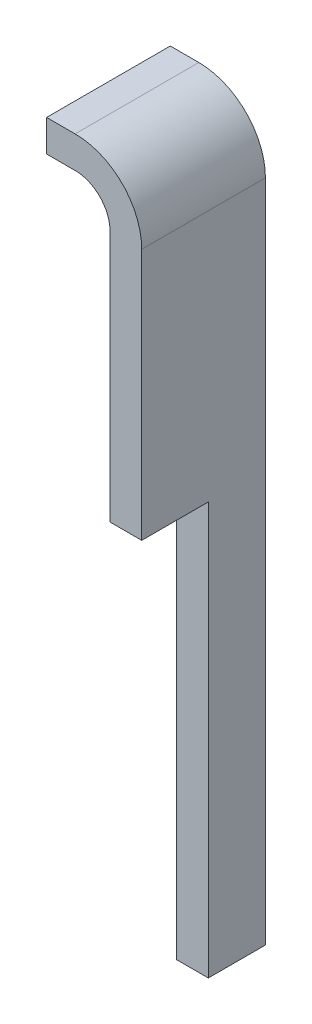
ISO-10303-21;
HEADER;
FILE_DESCRIPTION(('STEP AP214'),'2;1');
FILE_NAME('part.step','',(''),(''),'','','');
FILE_SCHEMA(('AUTOMOTIVE_DESIGN { 1 0 10303 214 1 1 1 1 }'));
ENDSEC;
DATA;
#1=APPLICATION_CONTEXT('core data for automotive mechanical design processes');
#2=APPLICATION_PROTOCOL_DEFINITION('international standard','automotive_design',2000,#1);
#3=PRODUCT_CONTEXT('',#1,'mechanical');
#4=PRODUCT('Part','Part','',(#3));
#5=PRODUCT_RELATED_PRODUCT_CATEGORY('part','',(#4));
#6=PRODUCT_DEFINITION_FORMATION('','',#4);
#7=PRODUCT_DEFINITION_CONTEXT('part definition',#1,'design');
#8=PRODUCT_DEFINITION('design','',#6,#7);
#9=PRODUCT_DEFINITION_SHAPE('','',#8);
#10=(LENGTH_UNIT() NAMED_UNIT(*) SI_UNIT(.MILLI.,.METRE.));
#11=(NAMED_UNIT(*) PLANE_ANGLE_UNIT() SI_UNIT($,.RADIAN.));
#12=(NAMED_UNIT(*) SI_UNIT($,.STERADIAN.) SOLID_ANGLE_UNIT());
#13=UNCERTAINTY_MEASURE_WITH_UNIT(LENGTH_MEASURE(1.E-05),#10,'distance_accuracy_value','');
#14=(GEOMETRIC_REPRESENTATION_CONTEXT(3) GLOBAL_UNCERTAINTY_ASSIGNED_CONTEXT((#13)) GLOBAL_UNIT_ASSIGNED_CONTEXT((#10,
#11,#12)) REPRESENTATION_CONTEXT('',''));
#15=CARTESIAN_POINT('',(0.,0.,0.));
#16=DIRECTION('',(0.,0.,1.));
#17=DIRECTION('',(1.,0.,0.));
#18=AXIS2_PLACEMENT_3D('',#15,#16,#17);
#19=CARTESIAN_POINT('',(0.508,-5.7277,-0.762));
#20=DIRECTION('',(0.,-1.,0.));
#21=DIRECTION('',(0.,0.,-1.));
#22=AXIS2_PLACEMENT_3D('',#19,#20,#21);
#23=PLANE('',#22);
#24=DIRECTION('',(0.,0.,1.));
#25=VECTOR('',#24,1.);
#26=CARTESIAN_POINT('',(0.762,-5.7277,-0.2286));
#27=LINE('',#26,#25);
#28=CARTESIAN_POINT('',(0.762,-5.7277,-0.2286));
#29=VERTEX_POINT('',#28);
#30=CARTESIAN_POINT('',(0.762,-5.7277,0.2286));
#31=VERTEX_POINT('',#30);
#32=EDGE_CURVE('E148',#29,#31,#27,.T.);
#33=ORIENTED_EDGE('',*,*,#32,.T.);
#34=DIRECTION('',(1.,0.,0.));
#35=VECTOR('',#34,1.);
#36=CARTESIAN_POINT('',(0.508,-5.7277,0.2286));
#37=LINE('',#36,#35);
#38=CARTESIAN_POINT('',(0.508,-5.7277,0.2286));
#39=VERTEX_POINT('',#38);
#40=EDGE_CURVE('E11',#39,#31,#37,.T.);
#41=ORIENTED_EDGE('',*,*,#40,.F.);
#42=DIRECTION('',(0.,0.,1.));
#43=VECTOR('',#42,1.);
#44=CARTESIAN_POINT('',(0.508,-5.7277,-0.2286));
#45=LINE('',#44,#43);
#46=CARTESIAN_POINT('',(0.508,-5.7277,-0.2286));
#47=VERTEX_POINT('',#46);
#48=EDGE_CURVE('E96',#47,#39,#45,.T.);
#49=ORIENTED_EDGE('',*,*,#48,.F.);
#50=DIRECTION('',(1.,0.,0.));
#51=VECTOR('',#50,1.);
#52=CARTESIAN_POINT('',(0.508,-5.7277,-0.2286));
#53=LINE('',#52,#51);
#54=EDGE_CURVE('E150',#47,#29,#53,.T.);
#55=ORIENTED_EDGE('',*,*,#54,.T.);
#56=EDGE_LOOP('',(#33,#41,#49,#55));
#57=FACE_BOUND('',#56,.T.);
#58=ADVANCED_FACE('F16',(#57),#23,.T.);
#59=CARTESIAN_POINT('',(0.762,-5.7277,0.2286));
#60=DIRECTION('',(0.,0.,-1.));
#61=DIRECTION('',(0.,-1.,0.));
#62=AXIS2_PLACEMENT_3D('',#59,#60,#61);
#63=PLANE('',#62);
#64=DIRECTION('',(-1.,0.,0.));
#65=VECTOR('',#64,1.);
#66=CARTESIAN_POINT('',(0.762,-2.4257,0.2286));
#67=LINE('',#66,#65);
#68=CARTESIAN_POINT('',(0.762,-2.4257,0.2286));
#69=VERTEX_POINT('',#68);
#70=CARTESIAN_POINT('',(0.508,-2.4257,0.2286));
#71=VERTEX_POINT('',#70);
#72=EDGE_CURVE('E165',#69,#71,#67,.T.);
#73=ORIENTED_EDGE('',*,*,#72,.T.);
#74=DIRECTION('',(0.,1.,0.));
#75=VECTOR('',#74,1.);
#76=CARTESIAN_POINT('',(0.508,-5.7277,0.2286));
#77=LINE('',#76,#75);
#78=EDGE_CURVE('E27',#39,#71,#77,.T.);
#79=ORIENTED_EDGE('',*,*,#78,.F.);
#80=ORIENTED_EDGE('',*,*,#40,.T.);
#81=DIRECTION('',(0.,1.,0.));
#82=VECTOR('',#81,1.);
#83=CARTESIAN_POINT('',(0.762,-5.7277,0.2286));
#84=LINE('',#83,#82);
#85=EDGE_CURVE('E156',#31,#69,#84,.T.);
#86=ORIENTED_EDGE('',*,*,#85,.T.);
#87=EDGE_LOOP('',(#73,#79,#80,#86));
#88=FACE_BOUND('',#87,.T.);
#89=ADVANCED_FACE('F253',(#88),#63,.F.);
#90=CARTESIAN_POINT('',(0.508,-0.4064,-0.762));
#91=DIRECTION('',(-1.,0.,0.));
#92=DIRECTION('',(0.,0.,1.));
#93=AXIS2_PLACEMENT_3D('',#90,#91,#92);
#94=PLANE('',#93);
#95=ORIENTED_EDGE('',*,*,#48,.T.);
#96=ORIENTED_EDGE('',*,*,#78,.T.);
#97=DIRECTION('',(0.,0.,-1.));
#98=VECTOR('',#97,1.);
#99=CARTESIAN_POINT('',(0.508,-2.4257,0.762));
#100=LINE('',#99,#98);
#101=CARTESIAN_POINT('',(0.508,-2.4257,0.762));
#102=VERTEX_POINT('',#101);
#103=EDGE_CURVE('E172',#102,#71,#100,.T.);
#104=ORIENTED_EDGE('',*,*,#103,.F.);
#105=DIRECTION('',(0.,-1.,0.));
#106=VECTOR('',#105,1.);
#107=CARTESIAN_POINT('',(0.508,-0.4064,0.762));
#108=LINE('',#107,#106);
#109=CARTESIAN_POINT('',(0.508,-0.4064,0.762));
#110=VERTEX_POINT('',#109);
#111=EDGE_CURVE('E201',#110,#102,#108,.T.);
#112=ORIENTED_EDGE('',*,*,#111,.F.);
#113=DIRECTION('',(0.,0.,1.));
#114=VECTOR('',#113,1.);
#115=CARTESIAN_POINT('',(0.508,-0.4064,-0.2286));
#116=LINE('',#115,#114);
#117=CARTESIAN_POINT('',(0.508,-0.4064,-0.2286));
#118=VERTEX_POINT('',#117);
#119=EDGE_CURVE('E104',#118,#110,#116,.T.);
#120=ORIENTED_EDGE('',*,*,#119,.F.);
#121=DIRECTION('',(0.,-1.,0.));
#122=VECTOR('',#121,1.);
#123=CARTESIAN_POINT('',(0.508,-0.4064,-0.2286));
#124=LINE('',#123,#122);
#125=EDGE_CURVE('E208',#118,#47,#124,.T.);
#126=ORIENTED_EDGE('',*,*,#125,.T.);
#127=EDGE_LOOP('',(#95,#96,#104,#112,#120,#126));
#128=FACE_BOUND('',#127,.T.);
#129=ADVANCED_FACE('F251',(#128),#94,.T.);
#130=CARTESIAN_POINT('',(0.2286,-0.4064,-0.762));
#131=DIRECTION('',(0.,0.,1.));
#132=DIRECTION('',(1.,0.,0.));
#133=AXIS2_PLACEMENT_3D('',#130,#131,#132);
#134=CYLINDRICAL_SURFACE('',#133,0.2794);
#135=ORIENTED_EDGE('',*,*,#119,.T.);
#136=CARTESIAN_POINT('',(0.2286,-0.4064,0.762));
#137=DIRECTION('',(0.,0.,-1.));
#138=DIRECTION('',(0.,1.,0.));
#139=AXIS2_PLACEMENT_3D('',#136,#137,#138);
#140=CIRCLE('',#139,0.2794);
#141=CARTESIAN_POINT('',(0.2286,-0.127,0.762));
#142=VERTEX_POINT('',#141);
#143=EDGE_CURVE('E197',#142,#110,#140,.T.);
#144=ORIENTED_EDGE('',*,*,#143,.F.);
#145=DIRECTION('',(0.,0.,1.));
#146=VECTOR('',#145,1.);
#147=CARTESIAN_POINT('',(0.2286,-0.127,-0.2286));
#148=LINE('',#147,#146);
#149=CARTESIAN_POINT('',(0.2286,-0.127,-0.2286));
#150=VERTEX_POINT('',#149);
#151=EDGE_CURVE('E114',#150,#142,#148,.T.);
#152=ORIENTED_EDGE('',*,*,#151,.F.);
#153=CARTESIAN_POINT('',(0.2286,-0.4064,-0.2286));
#154=DIRECTION('',(0.,0.,1.));
#155=DIRECTION('',(1.,0.,0.));
#156=AXIS2_PLACEMENT_3D('',#153,#154,#155);
#157=CIRCLE('',#156,0.2794);
#158=EDGE_CURVE('E218',#118,#150,#157,.T.);
#159=ORIENTED_EDGE('',*,*,#158,.F.);
#160=EDGE_LOOP('',(#135,#144,#152,#159));
#161=FACE_BOUND('',#160,.T.);
#162=ADVANCED_FACE('F263',(#161),#134,.F.);
#163=CARTESIAN_POINT('',(0.,-0.127,-0.762));
#164=DIRECTION('',(0.,-1.,0.));
#165=DIRECTION('',(0.,0.,-1.));
#166=AXIS2_PLACEMENT_3D('',#163,#164,#165);
#167=PLANE('',#166);
#168=ORIENTED_EDGE('',*,*,#151,.T.);
#169=DIRECTION('',(1.,0.,0.));
#170=VECTOR('',#169,1.);
#171=CARTESIAN_POINT('',(0.,-0.127,0.762));
#172=LINE('',#171,#170);
#173=CARTESIAN_POINT('',(0.,-0.127,0.762));
#174=VERTEX_POINT('',#173);
#175=EDGE_CURVE('E176',#174,#142,#172,.T.);
#176=ORIENTED_EDGE('',*,*,#175,.F.);
#177=DIRECTION('',(0.,0.,1.));
#178=VECTOR('',#177,1.);
#179=CARTESIAN_POINT('',(0.,-0.127,-0.2286));
#180=LINE('',#179,#178);
#181=CARTESIAN_POINT('',(0.,-0.127,-0.2286));
#182=VERTEX_POINT('',#181);
#183=EDGE_CURVE('E184',#182,#174,#180,.T.);
#184=ORIENTED_EDGE('',*,*,#183,.F.);
#185=DIRECTION('',(1.,0.,0.));
#186=VECTOR('',#185,1.);
#187=CARTESIAN_POINT('',(0.,-0.127,-0.2286));
#188=LINE('',#187,#186);
#189=EDGE_CURVE('E216',#182,#150,#188,.T.);
#190=ORIENTED_EDGE('',*,*,#189,.T.);
#191=EDGE_LOOP('',(#168,#176,#184,#190));
#192=FACE_BOUND('',#191,.T.);
#193=ADVANCED_FACE('F269',(#192),#167,.T.);
#194=CARTESIAN_POINT('',(0.,0.127,-0.762));
#195=DIRECTION('',(-1.,0.,0.));
#196=DIRECTION('',(0.,0.,1.));
#197=AXIS2_PLACEMENT_3D('',#194,#195,#196);
#198=PLANE('',#197);
#199=ORIENTED_EDGE('',*,*,#183,.T.);
#200=DIRECTION('',(0.,-1.,0.));
#201=VECTOR('',#200,1.);
#202=CARTESIAN_POINT('',(0.,0.127,0.762));
#203=LINE('',#202,#201);
#204=CARTESIAN_POINT('',(0.,0.127,0.762));
#205=VERTEX_POINT('',#204);
#206=EDGE_CURVE('E185',#205,#174,#203,.T.);
#207=ORIENTED_EDGE('',*,*,#206,.F.);
#208=DIRECTION('',(0.,0.,1.));
#209=VECTOR('',#208,1.);
#210=CARTESIAN_POINT('',(0.,0.127,-0.2286));
#211=LINE('',#210,#209);
#212=CARTESIAN_POINT('',(0.,0.127,-0.2286));
#213=VERTEX_POINT('',#212);
#214=EDGE_CURVE('E181',#213,#205,#211,.T.);
#215=ORIENTED_EDGE('',*,*,#214,.F.);
#216=DIRECTION('',(0.,-1.,0.));
#217=VECTOR('',#216,1.);
#218=CARTESIAN_POINT('',(0.,0.127,-0.2286));
#219=LINE('',#218,#217);
#220=EDGE_CURVE('E211',#213,#182,#219,.T.);
#221=ORIENTED_EDGE('',*,*,#220,.T.);
#222=EDGE_LOOP('',(#199,#207,#215,#221));
#223=FACE_BOUND('',#222,.T.);
#224=ADVANCED_FACE('F272',(#223),#198,.T.);
#225=CARTESIAN_POINT('',(0.2286,0.127,-0.762));
#226=DIRECTION('',(0.,1.,0.));
#227=DIRECTION('',(1.,0.,0.));
#228=AXIS2_PLACEMENT_3D('',#225,#226,#227);
#229=PLANE('',#228);
#230=ORIENTED_EDGE('',*,*,#214,.T.);
#231=DIRECTION('',(-1.,0.,0.));
#232=VECTOR('',#231,1.);
#233=CARTESIAN_POINT('',(0.2286,0.127,0.762));
#234=LINE('',#233,#232);
#235=CARTESIAN_POINT('',(0.2286,0.127,0.762));
#236=VERTEX_POINT('',#235);
#237=EDGE_CURVE('E189',#236,#205,#234,.T.);
#238=ORIENTED_EDGE('',*,*,#237,.F.);
#239=DIRECTION('',(0.,0.,1.));
#240=VECTOR('',#239,1.);
#241=CARTESIAN_POINT('',(0.2286,0.127,-0.2286));
#242=LINE('',#241,#240);
#243=CARTESIAN_POINT('',(0.2286,0.127,-0.2286));
#244=VERTEX_POINT('',#243);
#245=EDGE_CURVE('E140',#244,#236,#242,.T.);
#246=ORIENTED_EDGE('',*,*,#245,.F.);
#247=DIRECTION('',(-1.,0.,0.));
#248=VECTOR('',#247,1.);
#249=CARTESIAN_POINT('',(0.2286,0.127,-0.2286));
#250=LINE('',#249,#248);
#251=EDGE_CURVE('E136',#244,#213,#250,.T.);
#252=ORIENTED_EDGE('',*,*,#251,.T.);
#253=EDGE_LOOP('',(#230,#238,#246,#252));
#254=FACE_BOUND('',#253,.T.);
#255=ADVANCED_FACE('F278',(#254),#229,.T.);
#256=CARTESIAN_POINT('',(0.2286,-0.4064,-0.762));
#257=DIRECTION('',(0.,0.,1.));
#258=DIRECTION('',(1.,0.,0.));
#259=AXIS2_PLACEMENT_3D('',#256,#257,#258);
#260=CYLINDRICAL_SURFACE('',#259,0.5334);
#261=ORIENTED_EDGE('',*,*,#245,.T.);
#262=CARTESIAN_POINT('',(0.2286,-0.4064,0.762));
#263=DIRECTION('',(0.,0.,1.));
#264=DIRECTION('',(1.,0.,0.));
#265=AXIS2_PLACEMENT_3D('',#262,#263,#264);
#266=CIRCLE('',#265,0.5334);
#267=CARTESIAN_POINT('',(0.762,-0.4064,0.762));
#268=VERTEX_POINT('',#267);
#269=EDGE_CURVE('E153',#268,#236,#266,.T.);
#270=ORIENTED_EDGE('',*,*,#269,.F.);
#271=DIRECTION('',(0.,0.,1.));
#272=VECTOR('',#271,1.);
#273=CARTESIAN_POINT('',(0.762,-0.4064,-0.2286));
#274=LINE('',#273,#272);
#275=CARTESIAN_POINT('',(0.762,-0.4064,-0.2286));
#276=VERTEX_POINT('',#275);
#277=EDGE_CURVE('E20',#276,#268,#274,.T.);
#278=ORIENTED_EDGE('',*,*,#277,.F.);
#279=CARTESIAN_POINT('',(0.2286,-0.4064,-0.2286));
#280=DIRECTION('',(0.,0.,1.));
#281=DIRECTION('',(1.,0.,0.));
#282=AXIS2_PLACEMENT_3D('',#279,#280,#281);
#283=CIRCLE('',#282,0.5334);
#284=EDGE_CURVE('E128',#276,#244,#283,.T.);
#285=ORIENTED_EDGE('',*,*,#284,.T.);
#286=EDGE_LOOP('',(#261,#270,#278,#285));
#287=FACE_BOUND('',#286,.T.);
#288=ADVANCED_FACE('F18',(#287),#260,.T.);
#289=CARTESIAN_POINT('',(0.762,-5.7277,-0.2286));
#290=DIRECTION('',(0.,0.,-1.));
#291=DIRECTION('',(0.,-1.,0.));
#292=AXIS2_PLACEMENT_3D('',#289,#290,#291);
#293=PLANE('',#292);
#294=ORIENTED_EDGE('',*,*,#54,.F.);
#295=ORIENTED_EDGE('',*,*,#125,.F.);
#296=ORIENTED_EDGE('',*,*,#158,.T.);
#297=ORIENTED_EDGE('',*,*,#189,.F.);
#298=ORIENTED_EDGE('',*,*,#220,.F.);
#299=ORIENTED_EDGE('',*,*,#251,.F.);
#300=ORIENTED_EDGE('',*,*,#284,.F.);
#301=DIRECTION('',(0.,1.,0.));
#302=VECTOR('',#301,1.);
#303=CARTESIAN_POINT('',(0.762,-5.7277,-0.2286));
#304=LINE('',#303,#302);
#305=EDGE_CURVE('E132',#29,#276,#304,.T.);
#306=ORIENTED_EDGE('',*,*,#305,.F.);
#307=EDGE_LOOP('',(#294,#295,#296,#297,#298,#299,#300,#306));
#308=FACE_BOUND('',#307,.T.);
#309=ADVANCED_FACE('F131',(#308),#293,.T.);
#310=CARTESIAN_POINT('',(0.762,-5.7277,-0.762));
#311=DIRECTION('',(1.,0.,0.));
#312=DIRECTION('',(0.,1.,0.));
#313=AXIS2_PLACEMENT_3D('',#310,#311,#312);
#314=PLANE('',#313);
#315=ORIENTED_EDGE('',*,*,#277,.T.);
#316=DIRECTION('',(0.,1.,0.));
#317=VECTOR('',#316,1.);
#318=CARTESIAN_POINT('',(0.762,-2.4257,0.762));
#319=LINE('',#318,#317);
#320=CARTESIAN_POINT('',(0.762,-2.4257,0.762));
#321=VERTEX_POINT('',#320);
#322=EDGE_CURVE('E237',#321,#268,#319,.T.);
#323=ORIENTED_EDGE('',*,*,#322,.F.);
#324=DIRECTION('',(0.,0.,-1.));
#325=VECTOR('',#324,1.);
#326=CARTESIAN_POINT('',(0.762,-2.4257,0.762));
#327=LINE('',#326,#325);
#328=EDGE_CURVE('E157',#321,#69,#327,.T.);
#329=ORIENTED_EDGE('',*,*,#328,.T.);
#330=ORIENTED_EDGE('',*,*,#85,.F.);
#331=ORIENTED_EDGE('',*,*,#32,.F.);
#332=ORIENTED_EDGE('',*,*,#305,.T.);
#333=EDGE_LOOP('',(#315,#323,#329,#330,#331,#332));
#334=FACE_BOUND('',#333,.T.);
#335=ADVANCED_FACE('F144',(#334),#314,.T.);
#336=CARTESIAN_POINT('',(0.762,-2.4257,0.2286));
#337=DIRECTION('',(0.,1.,0.));
#338=DIRECTION('',(1.,0.,0.));
#339=AXIS2_PLACEMENT_3D('',#336,#337,#338);
#340=PLANE('',#339);
#341=ORIENTED_EDGE('',*,*,#103,.T.);
#342=ORIENTED_EDGE('',*,*,#72,.F.);
#343=ORIENTED_EDGE('',*,*,#328,.F.);
#344=DIRECTION('',(1.,0.,0.));
#345=VECTOR('',#344,1.);
#346=CARTESIAN_POINT('',(0.508,-2.4257,0.762));
#347=LINE('',#346,#345);
#348=EDGE_CURVE('E205',#102,#321,#347,.T.);
#349=ORIENTED_EDGE('',*,*,#348,.F.);
#350=EDGE_LOOP('',(#341,#342,#343,#349));
#351=FACE_BOUND('',#350,.T.);
#352=ADVANCED_FACE('F250',(#351),#340,.F.);
#353=CARTESIAN_POINT('',(0.,0.,0.762));
#354=DIRECTION('',(0.,0.,1.));
#355=DIRECTION('',(1.,0.,0.));
#356=AXIS2_PLACEMENT_3D('',#353,#354,#355);
#357=PLANE('',#356);
#358=ORIENTED_EDGE('',*,*,#322,.T.);
#359=ORIENTED_EDGE('',*,*,#269,.T.);
#360=ORIENTED_EDGE('',*,*,#237,.T.);
#361=ORIENTED_EDGE('',*,*,#206,.T.);
#362=ORIENTED_EDGE('',*,*,#175,.T.);
#363=ORIENTED_EDGE('',*,*,#143,.T.);
#364=ORIENTED_EDGE('',*,*,#111,.T.);
#365=ORIENTED_EDGE('',*,*,#348,.T.);
#366=EDGE_LOOP('',(#358,#359,#360,#361,#362,#363,#364,#365));
#367=FACE_BOUND('',#366,.T.);
#368=ADVANCED_FACE('F266',(#367),#357,.T.);
#369=CLOSED_SHELL('',(#58,#89,#129,#162,#193,#224,#255,#288,#309,#335,#352,#368));
#370=MANIFOLD_SOLID_BREP('B1',#369);
#371=ADVANCED_BREP_SHAPE_REPRESENTATION('',(#18,#370),#14);
#372=SHAPE_DEFINITION_REPRESENTATION(#9,#371);
ENDSEC;
END-ISO-10303-21;
